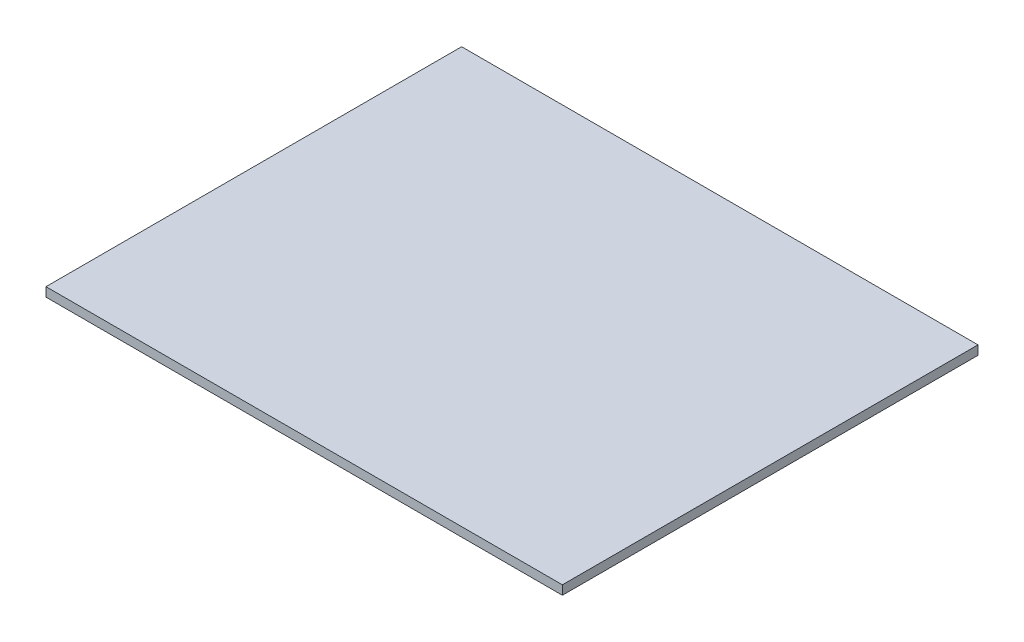
ISO-10303-21;
HEADER;
FILE_DESCRIPTION(('STEP AP214'),'2;1');
FILE_NAME('part.step','',(''),(''),'','','');
FILE_SCHEMA(('AUTOMOTIVE_DESIGN { 1 0 10303 214 1 1 1 1 }'));
ENDSEC;
DATA;
#1=APPLICATION_CONTEXT('core data for automotive mechanical design processes');
#2=APPLICATION_PROTOCOL_DEFINITION('international standard','automotive_design',2000,#1);
#3=PRODUCT_CONTEXT('',#1,'mechanical');
#4=PRODUCT('Part','Part','',(#3));
#5=PRODUCT_RELATED_PRODUCT_CATEGORY('part','',(#4));
#6=PRODUCT_DEFINITION_FORMATION('','',#4);
#7=PRODUCT_DEFINITION_CONTEXT('part definition',#1,'design');
#8=PRODUCT_DEFINITION('design','',#6,#7);
#9=PRODUCT_DEFINITION_SHAPE('','',#8);
#10=(LENGTH_UNIT() NAMED_UNIT(*) SI_UNIT(.MILLI.,.METRE.));
#11=(NAMED_UNIT(*) PLANE_ANGLE_UNIT() SI_UNIT($,.RADIAN.));
#12=(NAMED_UNIT(*) SI_UNIT($,.STERADIAN.) SOLID_ANGLE_UNIT());
#13=UNCERTAINTY_MEASURE_WITH_UNIT(LENGTH_MEASURE(1.E-05),#10,'distance_accuracy_value','');
#14=(GEOMETRIC_REPRESENTATION_CONTEXT(3) GLOBAL_UNCERTAINTY_ASSIGNED_CONTEXT((#13)) GLOBAL_UNIT_ASSIGNED_CONTEXT((#10,
#11,#12)) REPRESENTATION_CONTEXT('',''));
#15=CARTESIAN_POINT('',(0.,0.,0.));
#16=DIRECTION('',(0.,0.,1.));
#17=DIRECTION('',(1.,0.,0.));
#18=AXIS2_PLACEMENT_3D('',#15,#16,#17);
#19=CARTESIAN_POINT('',(123.,4.33,-99.0000000000001));
#20=DIRECTION('',(-1.,0.,0.));
#21=DIRECTION('',(0.,0.,1.));
#22=AXIS2_PLACEMENT_3D('',#19,#20,#21);
#23=PLANE('',#22);
#24=DIRECTION('',(0.,0.,-1.));
#25=VECTOR('',#24,1.);
#26=CARTESIAN_POINT('',(123.,0.,-99.0000000000001));
#27=LINE('',#26,#25);
#28=CARTESIAN_POINT('',(123.,0.,98.9999999999999));
#29=VERTEX_POINT('',#28);
#30=CARTESIAN_POINT('',(123.,0.,-99.0000000000001));
#31=VERTEX_POINT('',#30);
#32=EDGE_CURVE('E96',#29,#31,#27,.T.);
#33=ORIENTED_EDGE('',*,*,#32,.T.);
#34=DIRECTION('',(0.,-1.,0.));
#35=VECTOR('',#34,1.);
#36=CARTESIAN_POINT('',(123.,4.33,-99.0000000000001));
#37=LINE('',#36,#35);
#38=CARTESIAN_POINT('',(123.,4.33,-99.0000000000001));
#39=VERTEX_POINT('',#38);
#40=EDGE_CURVE('E11',#39,#31,#37,.T.);
#41=ORIENTED_EDGE('',*,*,#40,.F.);
#42=DIRECTION('',(0.,0.,-1.));
#43=VECTOR('',#42,1.);
#44=CARTESIAN_POINT('',(123.,4.33,-99.0000000000001));
#45=LINE('',#44,#43);
#46=CARTESIAN_POINT('',(123.,4.33,98.9999999999999));
#47=VERTEX_POINT('',#46);
#48=EDGE_CURVE('E84',#47,#39,#45,.T.);
#49=ORIENTED_EDGE('',*,*,#48,.F.);
#50=DIRECTION('',(0.,-1.,0.));
#51=VECTOR('',#50,1.);
#52=CARTESIAN_POINT('',(123.,4.33,98.9999999999999));
#53=LINE('',#52,#51);
#54=EDGE_CURVE('E92',#47,#29,#53,.T.);
#55=ORIENTED_EDGE('',*,*,#54,.T.);
#56=EDGE_LOOP('',(#33,#41,#49,#55));
#57=FACE_BOUND('',#56,.T.);
#58=ADVANCED_FACE('F33',(#57),#23,.F.);
#59=CARTESIAN_POINT('',(-123.,4.33,-99.));
#60=DIRECTION('',(0.,0.,1.));
#61=DIRECTION('',(1.,0.,0.));
#62=AXIS2_PLACEMENT_3D('',#59,#60,#61);
#63=PLANE('',#62);
#64=DIRECTION('',(-1.,0.,0.));
#65=VECTOR('',#64,1.);
#66=CARTESIAN_POINT('',(-123.,0.,-99.));
#67=LINE('',#66,#65);
#68=CARTESIAN_POINT('',(-123.,0.,-99.));
#69=VERTEX_POINT('',#68);
#70=EDGE_CURVE('E88',#31,#69,#67,.T.);
#71=ORIENTED_EDGE('',*,*,#70,.T.);
#72=DIRECTION('',(0.,-1.,0.));
#73=VECTOR('',#72,1.);
#74=CARTESIAN_POINT('',(-123.,4.33,-99.));
#75=LINE('',#74,#73);
#76=CARTESIAN_POINT('',(-123.,4.33,-99.));
#77=VERTEX_POINT('',#76);
#78=EDGE_CURVE('E41',#77,#69,#75,.T.);
#79=ORIENTED_EDGE('',*,*,#78,.F.);
#80=DIRECTION('',(-1.,0.,0.));
#81=VECTOR('',#80,1.);
#82=CARTESIAN_POINT('',(-123.,4.33,-99.));
#83=LINE('',#82,#81);
#84=EDGE_CURVE('E79',#39,#77,#83,.T.);
#85=ORIENTED_EDGE('',*,*,#84,.F.);
#86=ORIENTED_EDGE('',*,*,#40,.T.);
#87=EDGE_LOOP('',(#71,#79,#85,#86));
#88=FACE_BOUND('',#87,.T.);
#89=ADVANCED_FACE('F87',(#88),#63,.F.);
#90=CARTESIAN_POINT('',(-123.,4.33,-99.));
#91=DIRECTION('',(1.,0.,0.));
#92=DIRECTION('',(0.,0.,-1.));
#93=AXIS2_PLACEMENT_3D('',#90,#91,#92);
#94=PLANE('',#93);
#95=DIRECTION('',(0.,0.,1.));
#96=VECTOR('',#95,1.);
#97=CARTESIAN_POINT('',(-123.,0.,-99.));
#98=LINE('',#97,#96);
#99=CARTESIAN_POINT('',(-123.,0.,98.9999999999999));
#100=VERTEX_POINT('',#99);
#101=EDGE_CURVE('E66',#69,#100,#98,.T.);
#102=ORIENTED_EDGE('',*,*,#101,.T.);
#103=DIRECTION('',(0.,-1.,0.));
#104=VECTOR('',#103,1.);
#105=CARTESIAN_POINT('',(-123.,4.33,98.9999999999999));
#106=LINE('',#105,#104);
#107=CARTESIAN_POINT('',(-123.,4.33,98.9999999999999));
#108=VERTEX_POINT('',#107);
#109=EDGE_CURVE('E89',#108,#100,#106,.T.);
#110=ORIENTED_EDGE('',*,*,#109,.F.);
#111=DIRECTION('',(0.,0.,1.));
#112=VECTOR('',#111,1.);
#113=CARTESIAN_POINT('',(-123.,4.33,-99.));
#114=LINE('',#113,#112);
#115=EDGE_CURVE('E82',#77,#108,#114,.T.);
#116=ORIENTED_EDGE('',*,*,#115,.F.);
#117=ORIENTED_EDGE('',*,*,#78,.T.);
#118=EDGE_LOOP('',(#102,#110,#116,#117));
#119=FACE_BOUND('',#118,.T.);
#120=ADVANCED_FACE('F90',(#119),#94,.F.);
#121=CARTESIAN_POINT('',(-123.,4.33,98.9999999999999));
#122=DIRECTION('',(0.,0.,-1.));
#123=DIRECTION('',(-1.,0.,0.));
#124=AXIS2_PLACEMENT_3D('',#121,#122,#123);
#125=PLANE('',#124);
#126=DIRECTION('',(1.,0.,0.));
#127=VECTOR('',#126,1.);
#128=CARTESIAN_POINT('',(-123.,0.,98.9999999999999));
#129=LINE('',#128,#127);
#130=EDGE_CURVE('E72',#100,#29,#129,.T.);
#131=ORIENTED_EDGE('',*,*,#130,.T.);
#132=ORIENTED_EDGE('',*,*,#54,.F.);
#133=DIRECTION('',(1.,0.,0.));
#134=VECTOR('',#133,1.);
#135=CARTESIAN_POINT('',(-123.,4.33,98.9999999999999));
#136=LINE('',#135,#134);
#137=EDGE_CURVE('E49',#108,#47,#136,.T.);
#138=ORIENTED_EDGE('',*,*,#137,.F.);
#139=ORIENTED_EDGE('',*,*,#109,.T.);
#140=EDGE_LOOP('',(#131,#132,#138,#139));
#141=FACE_BOUND('',#140,.T.);
#142=ADVANCED_FACE('F103',(#141),#125,.F.);
#143=CARTESIAN_POINT('',(0.,4.33,0.));
#144=DIRECTION('',(0.,1.,0.));
#145=DIRECTION('',(0.,0.,1.));
#146=AXIS2_PLACEMENT_3D('',#143,#144,#145);
#147=PLANE('',#146);
#148=ORIENTED_EDGE('',*,*,#48,.T.);
#149=ORIENTED_EDGE('',*,*,#84,.T.);
#150=ORIENTED_EDGE('',*,*,#115,.T.);
#151=ORIENTED_EDGE('',*,*,#137,.T.);
#152=EDGE_LOOP('',(#148,#149,#150,#151));
#153=FACE_BOUND('',#152,.T.);
#154=ADVANCED_FACE('F80',(#153),#147,.T.);
#155=CARTESIAN_POINT('',(0.,0.,0.));
#156=DIRECTION('',(0.,1.,0.));
#157=DIRECTION('',(0.,0.,1.));
#158=AXIS2_PLACEMENT_3D('',#155,#156,#157);
#159=PLANE('',#158);
#160=ORIENTED_EDGE('',*,*,#32,.F.);
#161=ORIENTED_EDGE('',*,*,#130,.F.);
#162=ORIENTED_EDGE('',*,*,#101,.F.);
#163=ORIENTED_EDGE('',*,*,#70,.F.);
#164=EDGE_LOOP('',(#160,#161,#162,#163));
#165=FACE_BOUND('',#164,.T.);
#166=ADVANCED_FACE('F106',(#165),#159,.F.);
#167=CLOSED_SHELL('',(#58,#89,#120,#142,#154,#166));
#168=MANIFOLD_SOLID_BREP('B2',#167);
#169=ADVANCED_BREP_SHAPE_REPRESENTATION('',(#18,#168),#14);
#170=SHAPE_DEFINITION_REPRESENTATION(#9,#169);
ENDSEC;
END-ISO-10303-21;
